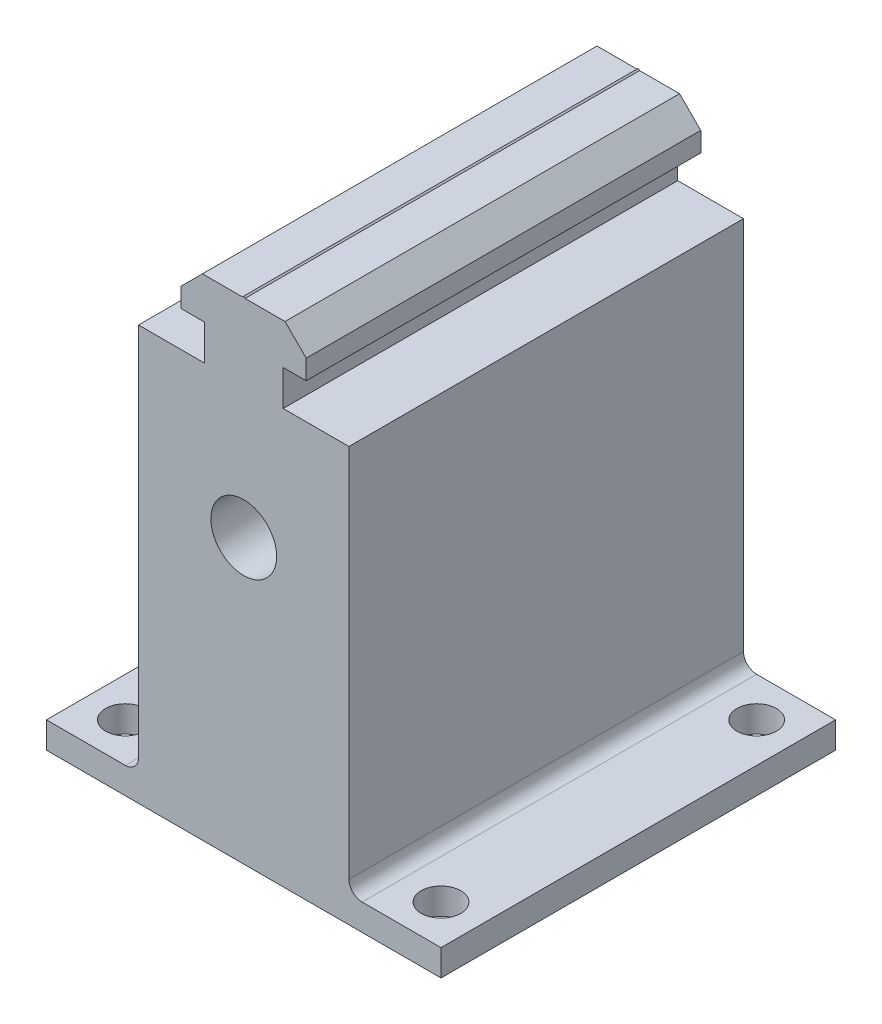
ISO-10303-21;
HEADER;
FILE_DESCRIPTION(('STEP AP214'),'2;1');
FILE_NAME('part.step','',(''),(''),'','','');
FILE_SCHEMA(('AUTOMOTIVE_DESIGN { 1 0 10303 214 1 1 1 1 }'));
ENDSEC;
DATA;
#1=APPLICATION_CONTEXT('core data for automotive mechanical design processes');
#2=APPLICATION_PROTOCOL_DEFINITION('international standard','automotive_design',2000,#1);
#3=PRODUCT_CONTEXT('',#1,'mechanical');
#4=PRODUCT('Part','Part','',(#3));
#5=PRODUCT_RELATED_PRODUCT_CATEGORY('part','',(#4));
#6=PRODUCT_DEFINITION_FORMATION('','',#4);
#7=PRODUCT_DEFINITION_CONTEXT('part definition',#1,'design');
#8=PRODUCT_DEFINITION('design','',#6,#7);
#9=PRODUCT_DEFINITION_SHAPE('','',#8);
#10=(LENGTH_UNIT() NAMED_UNIT(*) SI_UNIT(.MILLI.,.METRE.));
#11=(NAMED_UNIT(*) PLANE_ANGLE_UNIT() SI_UNIT($,.RADIAN.));
#12=(NAMED_UNIT(*) SI_UNIT($,.STERADIAN.) SOLID_ANGLE_UNIT());
#13=UNCERTAINTY_MEASURE_WITH_UNIT(LENGTH_MEASURE(1.E-05),#10,'distance_accuracy_value','');
#14=(GEOMETRIC_REPRESENTATION_CONTEXT(3) GLOBAL_UNCERTAINTY_ASSIGNED_CONTEXT((#13)) GLOBAL_UNIT_ASSIGNED_CONTEXT((#10,
#11,#12)) REPRESENTATION_CONTEXT('',''));
#15=CARTESIAN_POINT('',(0.,0.,0.));
#16=DIRECTION('',(0.,0.,1.));
#17=DIRECTION('',(1.,0.,0.));
#18=AXIS2_PLACEMENT_3D('',#15,#16,#17);
#19=CARTESIAN_POINT('',(0.,31.5,0.));
#20=DIRECTION('',(0.,1.,0.));
#21=DIRECTION('',(0.,0.,1.));
#22=AXIS2_PLACEMENT_3D('',#19,#20,#21);
#23=PLANE('',#22);
#24=DIRECTION('',(-1.,0.,0.));
#25=VECTOR('',#24,1.);
#26=CARTESIAN_POINT('',(-8.,31.5,-15.));
#27=LINE('',#26,#25);
#28=CARTESIAN_POINT('',(8.,31.5,-15.));
#29=VERTEX_POINT('',#28);
#30=CARTESIAN_POINT('',(2.99999999999999,31.5,-15.));
#31=VERTEX_POINT('',#30);
#32=EDGE_CURVE('E308',#29,#31,#27,.T.);
#33=ORIENTED_EDGE('',*,*,#32,.T.);
#34=DIRECTION('',(0.,0.,1.));
#35=VECTOR('',#34,1.);
#36=CARTESIAN_POINT('',(2.99999999999999,31.5,-15.));
#37=LINE('',#36,#35);
#38=CARTESIAN_POINT('',(2.99999999999999,31.5,15.));
#39=VERTEX_POINT('',#38);
#40=EDGE_CURVE('E283',#31,#39,#37,.T.);
#41=ORIENTED_EDGE('',*,*,#40,.T.);
#42=DIRECTION('',(1.,0.,0.));
#43=VECTOR('',#42,1.);
#44=CARTESIAN_POINT('',(-8.,31.5,15.));
#45=LINE('',#44,#43);
#46=CARTESIAN_POINT('',(8.,31.5,15.));
#47=VERTEX_POINT('',#46);
#48=EDGE_CURVE('E301',#39,#47,#45,.T.);
#49=ORIENTED_EDGE('',*,*,#48,.T.);
#50=DIRECTION('',(0.,0.,-1.));
#51=VECTOR('',#50,1.);
#52=CARTESIAN_POINT('',(8.,31.5,-15.));
#53=LINE('',#52,#51);
#54=EDGE_CURVE('E305',#47,#29,#53,.T.);
#55=ORIENTED_EDGE('',*,*,#54,.T.);
#56=EDGE_LOOP('',(#33,#41,#49,#55));
#57=FACE_BOUND('',#56,.T.);
#58=ADVANCED_FACE('F36',(#57),#23,.T.);
#59=CARTESIAN_POINT('',(0.,2.,0.));
#60=DIRECTION('',(0.,1.,0.));
#61=DIRECTION('',(0.,0.,1.));
#62=AXIS2_PLACEMENT_3D('',#59,#60,#61);
#63=PLANE('',#62);
#64=DIRECTION('',(1.,0.,0.));
#65=VECTOR('',#64,1.);
#66=CARTESIAN_POINT('',(0.,2.,15.));
#67=LINE('',#66,#65);
#68=CARTESIAN_POINT('',(-15.,2.,15.));
#69=VERTEX_POINT('',#68);
#70=CARTESIAN_POINT('',(-9.,2.,15.));
#71=VERTEX_POINT('',#70);
#72=EDGE_CURVE('E323',#69,#71,#67,.T.);
#73=ORIENTED_EDGE('',*,*,#72,.T.);
#74=DIRECTION('',(0.,0.,1.));
#75=VECTOR('',#74,1.);
#76=CARTESIAN_POINT('',(-9.,2.,0.));
#77=LINE('',#76,#75);
#78=CARTESIAN_POINT('',(-9.00000000000001,2.,-15.));
#79=VERTEX_POINT('',#78);
#80=EDGE_CURVE('E388',#71,#79,#77,.F.);
#81=ORIENTED_EDGE('',*,*,#80,.T.);
#82=DIRECTION('',(1.,0.,0.));
#83=VECTOR('',#82,1.);
#84=CARTESIAN_POINT('',(0.,2.,-15.));
#85=LINE('',#84,#83);
#86=CARTESIAN_POINT('',(-15.,2.,-15.));
#87=VERTEX_POINT('',#86);
#88=EDGE_CURVE('E330',#87,#79,#85,.T.);
#89=ORIENTED_EDGE('',*,*,#88,.F.);
#90=DIRECTION('',(0.,0.,-1.));
#91=VECTOR('',#90,1.);
#92=CARTESIAN_POINT('',(-15.,2.,0.));
#93=LINE('',#92,#91);
#94=EDGE_CURVE('E333',#69,#87,#93,.T.);
#95=ORIENTED_EDGE('',*,*,#94,.F.);
#96=EDGE_LOOP('',(#73,#81,#89,#95));
#97=FACE_BOUND('',#96,.T.);
#98=CARTESIAN_POINT('',(-12.,2.,-12.));
#99=DIRECTION('',(0.,1.,0.));
#100=DIRECTION('',(0.,0.,1.));
#101=AXIS2_PLACEMENT_3D('',#98,#99,#100);
#102=CIRCLE('',#101,1.5);
#103=CARTESIAN_POINT('',(-12.,2.,-10.5));
#104=VERTEX_POINT('',#103);
#105=EDGE_CURVE('E339',#104,#104,#102,.T.);
#106=ORIENTED_EDGE('',*,*,#105,.F.);
#107=EDGE_LOOP('',(#106));
#108=FACE_BOUND('',#107,.T.);
#109=CARTESIAN_POINT('',(-12.,2.,12.));
#110=DIRECTION('',(0.,1.,0.));
#111=DIRECTION('',(0.,0.,1.));
#112=AXIS2_PLACEMENT_3D('',#109,#110,#111);
#113=CIRCLE('',#112,1.5);
#114=CARTESIAN_POINT('',(-12.,2.,13.5));
#115=VERTEX_POINT('',#114);
#116=EDGE_CURVE('E336',#115,#115,#113,.F.);
#117=ORIENTED_EDGE('',*,*,#116,.T.);
#118=EDGE_LOOP('',(#117));
#119=FACE_BOUND('',#118,.T.);
#120=ADVANCED_FACE('F427',(#97,#108,#119),#63,.T.);
#121=CARTESIAN_POINT('',(0.,2.,15.));
#122=DIRECTION('',(0.,0.,-1.));
#123=DIRECTION('',(-1.,0.,0.));
#124=AXIS2_PLACEMENT_3D('',#121,#122,#123);
#125=PLANE('',#124);
#126=CARTESIAN_POINT('',(0.,21.5,15.));
#127=DIRECTION('',(0.,0.,1.));
#128=DIRECTION('',(1.,0.,0.));
#129=AXIS2_PLACEMENT_3D('',#126,#127,#128);
#130=CIRCLE('',#129,2.5);
#131=CARTESIAN_POINT('',(2.5,21.5,15.));
#132=VERTEX_POINT('',#131);
#133=EDGE_CURVE('E272',#132,#132,#130,.T.);
#134=ORIENTED_EDGE('',*,*,#133,.F.);
#135=EDGE_LOOP('',(#134));
#136=FACE_BOUND('',#135,.T.);
#137=DIRECTION('',(1.,0.,0.));
#138=VECTOR('',#137,1.);
#139=CARTESIAN_POINT('',(0.,0.,15.));
#140=LINE('',#139,#138);
#141=CARTESIAN_POINT('',(-15.,0.,15.));
#142=VERTEX_POINT('',#141);
#143=CARTESIAN_POINT('',(15.,0.,15.));
#144=VERTEX_POINT('',#143);
#145=EDGE_CURVE('E322',#142,#144,#140,.T.);
#146=ORIENTED_EDGE('',*,*,#145,.T.);
#147=DIRECTION('',(0.,-1.,0.));
#148=VECTOR('',#147,1.);
#149=CARTESIAN_POINT('',(15.,2.,15.));
#150=LINE('',#149,#148);
#151=CARTESIAN_POINT('',(15.,2.,15.));
#152=VERTEX_POINT('',#151);
#153=EDGE_CURVE('E377',#152,#144,#150,.T.);
#154=ORIENTED_EDGE('',*,*,#153,.F.);
#155=CARTESIAN_POINT('',(9.,2.,15.));
#156=VERTEX_POINT('',#155);
#157=EDGE_CURVE('E326',#156,#152,#67,.T.);
#158=ORIENTED_EDGE('',*,*,#157,.F.);
#159=CARTESIAN_POINT('',(9.,3.,15.));
#160=DIRECTION('',(0.,0.,-1.));
#161=DIRECTION('',(-1.,0.,0.));
#162=AXIS2_PLACEMENT_3D('',#159,#160,#161);
#163=CIRCLE('',#162,1.);
#164=CARTESIAN_POINT('',(8.,3.,15.));
#165=VERTEX_POINT('',#164);
#166=EDGE_CURVE('E392',#156,#165,#163,.T.);
#167=ORIENTED_EDGE('',*,*,#166,.T.);
#168=DIRECTION('',(0.,-1.,0.));
#169=VECTOR('',#168,1.);
#170=CARTESIAN_POINT('',(8.,31.5,15.));
#171=LINE('',#170,#169);
#172=EDGE_CURVE('E317',#47,#165,#171,.T.);
#173=ORIENTED_EDGE('',*,*,#172,.F.);
#174=ORIENTED_EDGE('',*,*,#48,.F.);
#175=DIRECTION('',(0.,-1.,0.));
#176=VECTOR('',#175,1.);
#177=CARTESIAN_POINT('',(2.99999999999999,0.,15.));
#178=LINE('',#177,#176);
#179=CARTESIAN_POINT('',(2.99999999999999,34.2,15.));
#180=VERTEX_POINT('',#179);
#181=EDGE_CURVE('E52',#180,#39,#178,.T.);
#182=ORIENTED_EDGE('',*,*,#181,.F.);
#183=DIRECTION('',(1.,0.,0.));
#184=VECTOR('',#183,1.);
#185=CARTESIAN_POINT('',(-8.13634873761013E-13,34.1999999999999,15.));
#186=LINE('',#185,#184);
#187=CARTESIAN_POINT('',(4.74999999999997,34.2,15.));
#188=VERTEX_POINT('',#187);
#189=EDGE_CURVE('E262',#180,#188,#186,.T.);
#190=ORIENTED_EDGE('',*,*,#189,.T.);
#191=DIRECTION('',(0.,-1.,0.));
#192=VECTOR('',#191,1.);
#193=CARTESIAN_POINT('',(4.75000000000023,0.,15.));
#194=LINE('',#193,#192);
#195=CARTESIAN_POINT('',(4.74999999999997,35.6893398282203,15.));
#196=VERTEX_POINT('',#195);
#197=EDGE_CURVE('E265',#196,#188,#194,.T.);
#198=ORIENTED_EDGE('',*,*,#197,.F.);
#199=DIRECTION('',(0.707106781186555,-0.70710678118654,0.));
#200=VECTOR('',#199,1.);
#201=CARTESIAN_POINT('',(20.2196699141101,20.2196699141105,15.));
#202=LINE('',#201,#200);
#203=CARTESIAN_POINT('',(3.13933982822018,37.3,15.));
#204=VERTEX_POINT('',#203);
#205=EDGE_CURVE('E268',#204,#196,#202,.T.);
#206=ORIENTED_EDGE('',*,*,#205,.F.);
#207=DIRECTION('',(1.,0.,0.));
#208=VECTOR('',#207,1.);
#209=CARTESIAN_POINT('',(-3.40627579992989E-13,37.3,15.));
#210=LINE('',#209,#208);
#211=CARTESIAN_POINT('',(0.0999999999999543,37.3,15.));
#212=VERTEX_POINT('',#211);
#213=EDGE_CURVE('E212',#212,#204,#210,.T.);
#214=ORIENTED_EDGE('',*,*,#213,.F.);
#215=DIRECTION('',(0.707106781186548,-0.707106781186547,0.));
#216=VECTOR('',#215,1.);
#217=CARTESIAN_POINT('',(18.7,18.7,15.));
#218=LINE('',#217,#216);
#219=CARTESIAN_POINT('',(0.,37.4,15.));
#220=VERTEX_POINT('',#219);
#221=EDGE_CURVE('E243',#220,#212,#218,.T.);
#222=ORIENTED_EDGE('',*,*,#221,.F.);
#223=DIRECTION('',(-0.707106781186543,-0.707106781186552,0.));
#224=VECTOR('',#223,1.);
#225=CARTESIAN_POINT('',(-18.7,18.6999999999998,15.));
#226=LINE('',#225,#224);
#227=CARTESIAN_POINT('',(-0.100000000000044,37.3,15.));
#228=VERTEX_POINT('',#227);
#229=EDGE_CURVE('E198',#220,#228,#226,.T.);
#230=ORIENTED_EDGE('',*,*,#229,.T.);
#231=DIRECTION('',(-1.,0.,0.));
#232=VECTOR('',#231,1.);
#233=CARTESIAN_POINT('',(-2.55470684994742E-13,37.3,15.));
#234=LINE('',#233,#232);
#235=CARTESIAN_POINT('',(-3.13933982822026,37.3,15.));
#236=VERTEX_POINT('',#235);
#237=EDGE_CURVE('E246',#228,#236,#234,.T.);
#238=ORIENTED_EDGE('',*,*,#237,.T.);
#239=DIRECTION('',(-0.707106781186546,-0.707106781186549,0.));
#240=VECTOR('',#239,1.);
#241=CARTESIAN_POINT('',(-20.2196699141101,20.21966991411,15.));
#242=LINE('',#241,#240);
#243=CARTESIAN_POINT('',(-4.75000000000003,35.6893398282202,15.));
#244=VERTEX_POINT('',#243);
#245=EDGE_CURVE('E249',#236,#244,#242,.T.);
#246=ORIENTED_EDGE('',*,*,#245,.T.);
#247=DIRECTION('',(0.,-1.,0.));
#248=VECTOR('',#247,1.);
#249=CARTESIAN_POINT('',(-4.74999999999977,0.,15.));
#250=LINE('',#249,#248);
#251=CARTESIAN_POINT('',(-4.75000000000011,34.2,15.));
#252=VERTEX_POINT('',#251);
#253=EDGE_CURVE('E252',#244,#252,#250,.T.);
#254=ORIENTED_EDGE('',*,*,#253,.T.);
#255=DIRECTION('',(-1.,0.,0.));
#256=VECTOR('',#255,1.);
#257=CARTESIAN_POINT('',(0.,34.2,15.));
#258=LINE('',#257,#256);
#259=CARTESIAN_POINT('',(-3.00000000000002,34.2,15.));
#260=VERTEX_POINT('',#259);
#261=EDGE_CURVE('E255',#260,#252,#258,.T.);
#262=ORIENTED_EDGE('',*,*,#261,.F.);
#263=DIRECTION('',(0.,-1.,0.));
#264=VECTOR('',#263,1.);
#265=CARTESIAN_POINT('',(-3.00000000000002,0.,15.));
#266=LINE('',#265,#264);
#267=CARTESIAN_POINT('',(-3.00000000000002,31.5,15.));
#268=VERTEX_POINT('',#267);
#269=EDGE_CURVE('E258',#260,#268,#266,.T.);
#270=ORIENTED_EDGE('',*,*,#269,.T.);
#271=CARTESIAN_POINT('',(-8.,31.5,15.));
#272=VERTEX_POINT('',#271);
#273=EDGE_CURVE('E302',#272,#268,#45,.T.);
#274=ORIENTED_EDGE('',*,*,#273,.F.);
#275=DIRECTION('',(0.,-1.,0.));
#276=VECTOR('',#275,1.);
#277=CARTESIAN_POINT('',(-8.,31.5,15.));
#278=LINE('',#277,#276);
#279=CARTESIAN_POINT('',(-8.,3.,15.));
#280=VERTEX_POINT('',#279);
#281=EDGE_CURVE('E320',#272,#280,#278,.T.);
#282=ORIENTED_EDGE('',*,*,#281,.T.);
#283=CARTESIAN_POINT('',(-9.,3.,15.));
#284=DIRECTION('',(0.,0.,-1.));
#285=DIRECTION('',(-1.,0.,0.));
#286=AXIS2_PLACEMENT_3D('',#283,#284,#285);
#287=CIRCLE('',#286,1.);
#288=EDGE_CURVE('E45',#280,#71,#287,.T.);
#289=ORIENTED_EDGE('',*,*,#288,.T.);
#290=ORIENTED_EDGE('',*,*,#72,.F.);
#291=DIRECTION('',(0.,-1.,0.));
#292=VECTOR('',#291,1.);
#293=CARTESIAN_POINT('',(-15.,2.,15.));
#294=LINE('',#293,#292);
#295=EDGE_CURVE('E348',#69,#142,#294,.T.);
#296=ORIENTED_EDGE('',*,*,#295,.T.);
#297=EDGE_LOOP('',(#146,#154,#158,#167,#173,#174,#182,#190,#198,#206,#214,#222,#230,#238,#246,
#254,#262,#270,#274,#282,#289,#290,#296));
#298=FACE_BOUND('',#297,.T.);
#299=ADVANCED_FACE('F397',(#136,#298),#125,.F.);
#300=CARTESIAN_POINT('',(15.,2.,0.));
#301=DIRECTION('',(-1.,0.,0.));
#302=DIRECTION('',(0.,0.,1.));
#303=AXIS2_PLACEMENT_3D('',#300,#301,#302);
#304=PLANE('',#303);
#305=DIRECTION('',(0.,0.,-1.));
#306=VECTOR('',#305,1.);
#307=CARTESIAN_POINT('',(15.,0.,0.));
#308=LINE('',#307,#306);
#309=CARTESIAN_POINT('',(15.,0.,-15.));
#310=VERTEX_POINT('',#309);
#311=EDGE_CURVE('E351',#144,#310,#308,.T.);
#312=ORIENTED_EDGE('',*,*,#311,.T.);
#313=DIRECTION('',(0.,-1.,0.));
#314=VECTOR('',#313,1.);
#315=CARTESIAN_POINT('',(15.,2.,-15.));
#316=LINE('',#315,#314);
#317=CARTESIAN_POINT('',(15.,2.,-15.));
#318=VERTEX_POINT('',#317);
#319=EDGE_CURVE('E375',#318,#310,#316,.T.);
#320=ORIENTED_EDGE('',*,*,#319,.F.);
#321=DIRECTION('',(0.,0.,-1.));
#322=VECTOR('',#321,1.);
#323=CARTESIAN_POINT('',(15.,2.,0.));
#324=LINE('',#323,#322);
#325=EDGE_CURVE('E325',#152,#318,#324,.T.);
#326=ORIENTED_EDGE('',*,*,#325,.F.);
#327=ORIENTED_EDGE('',*,*,#153,.T.);
#328=EDGE_LOOP('',(#312,#320,#326,#327));
#329=FACE_BOUND('',#328,.T.);
#330=ADVANCED_FACE('F416',(#329),#304,.F.);
#331=CARTESIAN_POINT('',(0.,2.,-15.));
#332=DIRECTION('',(0.,0.,-1.));
#333=DIRECTION('',(-1.,0.,0.));
#334=AXIS2_PLACEMENT_3D('',#331,#332,#333);
#335=PLANE('',#334);
#336=CARTESIAN_POINT('',(0.,21.5,-15.));
#337=DIRECTION('',(0.,0.,-1.));
#338=DIRECTION('',(-1.,0.,0.));
#339=AXIS2_PLACEMENT_3D('',#336,#337,#338);
#340=CIRCLE('',#339,2.5);
#341=CARTESIAN_POINT('',(-2.5,21.5,-15.));
#342=VERTEX_POINT('',#341);
#343=EDGE_CURVE('E40',#342,#342,#340,.T.);
#344=ORIENTED_EDGE('',*,*,#343,.F.);
#345=EDGE_LOOP('',(#344));
#346=FACE_BOUND('',#345,.T.);
#347=DIRECTION('',(1.,0.,0.));
#348=VECTOR('',#347,1.);
#349=CARTESIAN_POINT('',(0.,0.,-15.));
#350=LINE('',#349,#348);
#351=CARTESIAN_POINT('',(-15.,0.,-15.));
#352=VERTEX_POINT('',#351);
#353=EDGE_CURVE('E354',#352,#310,#350,.T.);
#354=ORIENTED_EDGE('',*,*,#353,.F.);
#355=DIRECTION('',(0.,-1.,0.));
#356=VECTOR('',#355,1.);
#357=CARTESIAN_POINT('',(-15.,2.,-15.));
#358=LINE('',#357,#356);
#359=EDGE_CURVE('E373',#87,#352,#358,.T.);
#360=ORIENTED_EDGE('',*,*,#359,.F.);
#361=ORIENTED_EDGE('',*,*,#88,.T.);
#362=CARTESIAN_POINT('',(-9.00000000000001,3.,-15.));
#363=DIRECTION('',(0.,0.,-1.));
#364=DIRECTION('',(-1.,0.,0.));
#365=AXIS2_PLACEMENT_3D('',#362,#363,#364);
#366=CIRCLE('',#365,1.);
#367=CARTESIAN_POINT('',(-8.,3.,-15.));
#368=VERTEX_POINT('',#367);
#369=EDGE_CURVE('E11',#79,#368,#366,.F.);
#370=ORIENTED_EDGE('',*,*,#369,.T.);
#371=DIRECTION('',(0.,-1.,0.));
#372=VECTOR('',#371,1.);
#373=CARTESIAN_POINT('',(-8.,31.5,-15.));
#374=LINE('',#373,#372);
#375=CARTESIAN_POINT('',(-8.,31.5,-15.));
#376=VERTEX_POINT('',#375);
#377=EDGE_CURVE('E311',#376,#368,#374,.T.);
#378=ORIENTED_EDGE('',*,*,#377,.F.);
#379=CARTESIAN_POINT('',(-3.00000000000002,31.5,-15.));
#380=VERTEX_POINT('',#379);
#381=EDGE_CURVE('E307',#380,#376,#27,.T.);
#382=ORIENTED_EDGE('',*,*,#381,.F.);
#383=DIRECTION('',(0.,-1.,0.));
#384=VECTOR('',#383,1.);
#385=CARTESIAN_POINT('',(-3.00000000000002,0.,-15.));
#386=LINE('',#385,#384);
#387=CARTESIAN_POINT('',(-3.00000000000002,34.2,-15.));
#388=VERTEX_POINT('',#387);
#389=EDGE_CURVE('E231',#388,#380,#386,.T.);
#390=ORIENTED_EDGE('',*,*,#389,.F.);
#391=DIRECTION('',(-1.,0.,0.));
#392=VECTOR('',#391,1.);
#393=CARTESIAN_POINT('',(0.,34.2,-15.));
#394=LINE('',#393,#392);
#395=CARTESIAN_POINT('',(-4.75000000000011,34.2,-15.));
#396=VERTEX_POINT('',#395);
#397=EDGE_CURVE('E229',#388,#396,#394,.T.);
#398=ORIENTED_EDGE('',*,*,#397,.T.);
#399=DIRECTION('',(0.,-1.,0.));
#400=VECTOR('',#399,1.);
#401=CARTESIAN_POINT('',(-4.74999999999977,0.,-15.));
#402=LINE('',#401,#400);
#403=CARTESIAN_POINT('',(-4.75000000000003,35.6893398282202,-15.));
#404=VERTEX_POINT('',#403);
#405=EDGE_CURVE('E226',#404,#396,#402,.T.);
#406=ORIENTED_EDGE('',*,*,#405,.F.);
#407=DIRECTION('',(-0.707106781186546,-0.707106781186549,0.));
#408=VECTOR('',#407,1.);
#409=CARTESIAN_POINT('',(-20.2196699141101,20.21966991411,-15.));
#410=LINE('',#409,#408);
#411=CARTESIAN_POINT('',(-3.13933982822026,37.3,-15.));
#412=VERTEX_POINT('',#411);
#413=EDGE_CURVE('E221',#412,#404,#410,.T.);
#414=ORIENTED_EDGE('',*,*,#413,.F.);
#415=DIRECTION('',(-1.,0.,0.));
#416=VECTOR('',#415,1.);
#417=CARTESIAN_POINT('',(-2.55470684994742E-13,37.3,-15.));
#418=LINE('',#417,#416);
#419=CARTESIAN_POINT('',(-0.100000000000044,37.3,-15.));
#420=VERTEX_POINT('',#419);
#421=EDGE_CURVE('E219',#420,#412,#418,.T.);
#422=ORIENTED_EDGE('',*,*,#421,.F.);
#423=DIRECTION('',(-0.707106781186543,-0.707106781186552,0.));
#424=VECTOR('',#423,1.);
#425=CARTESIAN_POINT('',(-18.7,18.6999999999998,-15.));
#426=LINE('',#425,#424);
#427=CARTESIAN_POINT('',(0.,37.4,-15.));
#428=VERTEX_POINT('',#427);
#429=EDGE_CURVE('E196',#428,#420,#426,.T.);
#430=ORIENTED_EDGE('',*,*,#429,.F.);
#431=DIRECTION('',(0.707106781186548,-0.707106781186547,0.));
#432=VECTOR('',#431,1.);
#433=CARTESIAN_POINT('',(18.7,18.7,-15.));
#434=LINE('',#433,#432);
#435=CARTESIAN_POINT('',(0.0999999999999543,37.3,-15.));
#436=VERTEX_POINT('',#435);
#437=EDGE_CURVE('E207',#428,#436,#434,.T.);
#438=ORIENTED_EDGE('',*,*,#437,.T.);
#439=DIRECTION('',(1.,0.,0.));
#440=VECTOR('',#439,1.);
#441=CARTESIAN_POINT('',(-3.40627579992989E-13,37.3,-15.));
#442=LINE('',#441,#440);
#443=CARTESIAN_POINT('',(3.13933982822018,37.3,-15.));
#444=VERTEX_POINT('',#443);
#445=EDGE_CURVE('E203',#436,#444,#442,.T.);
#446=ORIENTED_EDGE('',*,*,#445,.T.);
#447=DIRECTION('',(0.707106781186555,-0.70710678118654,0.));
#448=VECTOR('',#447,1.);
#449=CARTESIAN_POINT('',(20.2196699141101,20.2196699141105,-15.));
#450=LINE('',#449,#448);
#451=CARTESIAN_POINT('',(4.74999999999997,35.6893398282203,-15.));
#452=VERTEX_POINT('',#451);
#453=EDGE_CURVE('E240',#444,#452,#450,.T.);
#454=ORIENTED_EDGE('',*,*,#453,.T.);
#455=DIRECTION('',(0.,-1.,0.));
#456=VECTOR('',#455,1.);
#457=CARTESIAN_POINT('',(4.75000000000023,0.,-15.));
#458=LINE('',#457,#456);
#459=CARTESIAN_POINT('',(4.74999999999997,34.2,-15.));
#460=VERTEX_POINT('',#459);
#461=EDGE_CURVE('E238',#452,#460,#458,.T.);
#462=ORIENTED_EDGE('',*,*,#461,.T.);
#463=DIRECTION('',(1.,0.,0.));
#464=VECTOR('',#463,1.);
#465=CARTESIAN_POINT('',(-8.13634873761013E-13,34.1999999999999,-15.));
#466=LINE('',#465,#464);
#467=CARTESIAN_POINT('',(2.99999999999999,34.2,-15.));
#468=VERTEX_POINT('',#467);
#469=EDGE_CURVE('E235',#468,#460,#466,.T.);
#470=ORIENTED_EDGE('',*,*,#469,.F.);
#471=DIRECTION('',(0.,-1.,0.));
#472=VECTOR('',#471,1.);
#473=CARTESIAN_POINT('',(2.99999999999999,0.,-15.));
#474=LINE('',#473,#472);
#475=EDGE_CURVE('E233',#468,#31,#474,.T.);
#476=ORIENTED_EDGE('',*,*,#475,.T.);
#477=ORIENTED_EDGE('',*,*,#32,.F.);
#478=DIRECTION('',(0.,-1.,0.));
#479=VECTOR('',#478,1.);
#480=CARTESIAN_POINT('',(8.,31.5,-15.));
#481=LINE('',#480,#479);
#482=CARTESIAN_POINT('',(8.,3.,-15.));
#483=VERTEX_POINT('',#482);
#484=EDGE_CURVE('E314',#29,#483,#481,.T.);
#485=ORIENTED_EDGE('',*,*,#484,.T.);
#486=CARTESIAN_POINT('',(9.00000000000001,3.,-15.));
#487=DIRECTION('',(0.,0.,-1.));
#488=DIRECTION('',(-1.,0.,0.));
#489=AXIS2_PLACEMENT_3D('',#486,#487,#488);
#490=CIRCLE('',#489,1.);
#491=CARTESIAN_POINT('',(9.00000000000001,2.,-15.));
#492=VERTEX_POINT('',#491);
#493=EDGE_CURVE('E390',#483,#492,#490,.F.);
#494=ORIENTED_EDGE('',*,*,#493,.T.);
#495=EDGE_CURVE('E329',#492,#318,#85,.T.);
#496=ORIENTED_EDGE('',*,*,#495,.T.);
#497=ORIENTED_EDGE('',*,*,#319,.T.);
#498=EDGE_LOOP('',(#354,#360,#361,#370,#378,#382,#390,#398,#406,#414,#422,#430,#438,#446,#454,
#462,#470,#476,#477,#485,#494,#496,#497));
#499=FACE_BOUND('',#498,.T.);
#500=ADVANCED_FACE('F216',(#346,#499),#335,.T.);
#501=CARTESIAN_POINT('',(12.,2.,-12.));
#502=DIRECTION('',(0.,-1.,0.));
#503=DIRECTION('',(0.,0.,-1.));
#504=AXIS2_PLACEMENT_3D('',#501,#502,#503);
#505=CYLINDRICAL_SURFACE('',#504,1.5);
#506=CARTESIAN_POINT('',(12.,2.,-12.));
#507=DIRECTION('',(0.,1.,0.));
#508=DIRECTION('',(0.,0.,1.));
#509=AXIS2_PLACEMENT_3D('',#506,#507,#508);
#510=CIRCLE('',#509,1.5);
#511=CARTESIAN_POINT('',(12.,2.,-10.5));
#512=VERTEX_POINT('',#511);
#513=EDGE_CURVE('E342',#512,#512,#510,.F.);
#514=ORIENTED_EDGE('',*,*,#513,.F.);
#515=EDGE_LOOP('',(#514));
#516=FACE_BOUND('',#515,.T.);
#517=CARTESIAN_POINT('',(12.,0.,-12.));
#518=DIRECTION('',(0.,1.,0.));
#519=DIRECTION('',(0.,0.,1.));
#520=AXIS2_PLACEMENT_3D('',#517,#518,#519);
#521=CIRCLE('',#520,1.5);
#522=CARTESIAN_POINT('',(12.,0.,-10.5));
#523=VERTEX_POINT('',#522);
#524=EDGE_CURVE('E366',#523,#523,#521,.F.);
#525=ORIENTED_EDGE('',*,*,#524,.T.);
#526=EDGE_LOOP('',(#525));
#527=FACE_BOUND('',#526,.T.);
#528=ADVANCED_FACE('F506',(#516,#527),#505,.F.);
#529=CARTESIAN_POINT('',(-12.,2.,-12.));
#530=DIRECTION('',(0.,-1.,0.));
#531=DIRECTION('',(0.,0.,-1.));
#532=AXIS2_PLACEMENT_3D('',#529,#530,#531);
#533=CYLINDRICAL_SURFACE('',#532,1.5);
#534=ORIENTED_EDGE('',*,*,#105,.T.);
#535=EDGE_LOOP('',(#534));
#536=FACE_BOUND('',#535,.T.);
#537=CARTESIAN_POINT('',(-12.,0.,-12.));
#538=DIRECTION('',(0.,1.,0.));
#539=DIRECTION('',(0.,0.,1.));
#540=AXIS2_PLACEMENT_3D('',#537,#538,#539);
#541=CIRCLE('',#540,1.5);
#542=CARTESIAN_POINT('',(-12.,0.,-10.5));
#543=VERTEX_POINT('',#542);
#544=EDGE_CURVE('E363',#543,#543,#541,.T.);
#545=ORIENTED_EDGE('',*,*,#544,.F.);
#546=EDGE_LOOP('',(#545));
#547=FACE_BOUND('',#546,.T.);
#548=ADVANCED_FACE('F509',(#536,#547),#533,.F.);
#549=CARTESIAN_POINT('',(-12.,2.,12.));
#550=DIRECTION('',(0.,-1.,0.));
#551=DIRECTION('',(0.,0.,-1.));
#552=AXIS2_PLACEMENT_3D('',#549,#550,#551);
#553=CYLINDRICAL_SURFACE('',#552,1.5);
#554=ORIENTED_EDGE('',*,*,#116,.F.);
#555=EDGE_LOOP('',(#554));
#556=FACE_BOUND('',#555,.T.);
#557=CARTESIAN_POINT('',(-12.,0.,12.));
#558=DIRECTION('',(0.,1.,0.));
#559=DIRECTION('',(0.,0.,1.));
#560=AXIS2_PLACEMENT_3D('',#557,#558,#559);
#561=CIRCLE('',#560,1.5);
#562=CARTESIAN_POINT('',(-12.,0.,13.5));
#563=VERTEX_POINT('',#562);
#564=EDGE_CURVE('E360',#563,#563,#561,.F.);
#565=ORIENTED_EDGE('',*,*,#564,.T.);
#566=EDGE_LOOP('',(#565));
#567=FACE_BOUND('',#566,.T.);
#568=ADVANCED_FACE('F513',(#556,#567),#553,.F.);
#569=CARTESIAN_POINT('',(-15.,2.,0.));
#570=DIRECTION('',(-1.,0.,0.));
#571=DIRECTION('',(0.,0.,1.));
#572=AXIS2_PLACEMENT_3D('',#569,#570,#571);
#573=PLANE('',#572);
#574=DIRECTION('',(0.,0.,-1.));
#575=VECTOR('',#574,1.);
#576=CARTESIAN_POINT('',(-15.,0.,0.));
#577=LINE('',#576,#575);
#578=EDGE_CURVE('E357',#142,#352,#577,.T.);
#579=ORIENTED_EDGE('',*,*,#578,.F.);
#580=ORIENTED_EDGE('',*,*,#295,.F.);
#581=ORIENTED_EDGE('',*,*,#94,.T.);
#582=ORIENTED_EDGE('',*,*,#359,.T.);
#583=EDGE_LOOP('',(#579,#580,#581,#582));
#584=FACE_BOUND('',#583,.T.);
#585=ADVANCED_FACE('F424',(#584),#573,.T.);
#586=CARTESIAN_POINT('',(12.,2.,12.));
#587=DIRECTION('',(0.,-1.,0.));
#588=DIRECTION('',(0.,0.,-1.));
#589=AXIS2_PLACEMENT_3D('',#586,#587,#588);
#590=CYLINDRICAL_SURFACE('',#589,1.5);
#591=CARTESIAN_POINT('',(12.,2.,12.));
#592=DIRECTION('',(0.,1.,0.));
#593=DIRECTION('',(0.,0.,1.));
#594=AXIS2_PLACEMENT_3D('',#591,#592,#593);
#595=CIRCLE('',#594,1.5);
#596=CARTESIAN_POINT('',(12.,2.,13.5));
#597=VERTEX_POINT('',#596);
#598=EDGE_CURVE('E345',#597,#597,#595,.T.);
#599=ORIENTED_EDGE('',*,*,#598,.T.);
#600=EDGE_LOOP('',(#599));
#601=FACE_BOUND('',#600,.T.);
#602=CARTESIAN_POINT('',(12.,0.,12.));
#603=DIRECTION('',(0.,1.,0.));
#604=DIRECTION('',(0.,0.,1.));
#605=AXIS2_PLACEMENT_3D('',#602,#603,#604);
#606=CIRCLE('',#605,1.5);
#607=CARTESIAN_POINT('',(12.,0.,13.5));
#608=VERTEX_POINT('',#607);
#609=EDGE_CURVE('E369',#608,#608,#606,.T.);
#610=ORIENTED_EDGE('',*,*,#609,.F.);
#611=EDGE_LOOP('',(#610));
#612=FACE_BOUND('',#611,.T.);
#613=ADVANCED_FACE('F500',(#601,#612),#590,.F.);
#614=ORIENTED_EDGE('',*,*,#495,.F.);
#615=DIRECTION('',(0.,0.,-1.));
#616=VECTOR('',#615,1.);
#617=CARTESIAN_POINT('',(9.,2.,0.));
#618=LINE('',#617,#616);
#619=EDGE_CURVE('E383',#492,#156,#618,.F.);
#620=ORIENTED_EDGE('',*,*,#619,.T.);
#621=ORIENTED_EDGE('',*,*,#157,.T.);
#622=ORIENTED_EDGE('',*,*,#325,.T.);
#623=EDGE_LOOP('',(#614,#620,#621,#622));
#624=FACE_BOUND('',#623,.T.);
#625=ORIENTED_EDGE('',*,*,#513,.T.);
#626=EDGE_LOOP('',(#625));
#627=FACE_BOUND('',#626,.T.);
#628=ORIENTED_EDGE('',*,*,#598,.F.);
#629=EDGE_LOOP('',(#628));
#630=FACE_BOUND('',#629,.T.);
#631=ADVANCED_FACE('F411',(#624,#627,#630),#63,.T.);
#632=CARTESIAN_POINT('',(0.,0.,0.));
#633=DIRECTION('',(0.,1.,0.));
#634=DIRECTION('',(0.,0.,1.));
#635=AXIS2_PLACEMENT_3D('',#632,#633,#634);
#636=PLANE('',#635);
#637=ORIENTED_EDGE('',*,*,#145,.F.);
#638=ORIENTED_EDGE('',*,*,#578,.T.);
#639=ORIENTED_EDGE('',*,*,#353,.T.);
#640=ORIENTED_EDGE('',*,*,#311,.F.);
#641=EDGE_LOOP('',(#637,#638,#639,#640));
#642=FACE_BOUND('',#641,.T.);
#643=ORIENTED_EDGE('',*,*,#564,.F.);
#644=EDGE_LOOP('',(#643));
#645=FACE_BOUND('',#644,.T.);
#646=ORIENTED_EDGE('',*,*,#544,.T.);
#647=EDGE_LOOP('',(#646));
#648=FACE_BOUND('',#647,.T.);
#649=ORIENTED_EDGE('',*,*,#524,.F.);
#650=EDGE_LOOP('',(#649));
#651=FACE_BOUND('',#650,.T.);
#652=ORIENTED_EDGE('',*,*,#609,.T.);
#653=EDGE_LOOP('',(#652));
#654=FACE_BOUND('',#653,.T.);
#655=ADVANCED_FACE('F421',(#642,#645,#648,#651,#654),#636,.F.);
#656=CARTESIAN_POINT('',(-8.,31.5,-15.));
#657=DIRECTION('',(1.,0.,0.));
#658=DIRECTION('',(0.,0.,-1.));
#659=AXIS2_PLACEMENT_3D('',#656,#657,#658);
#660=PLANE('',#659);
#661=ORIENTED_EDGE('',*,*,#377,.T.);
#662=DIRECTION('',(0.,0.,1.));
#663=VECTOR('',#662,1.);
#664=CARTESIAN_POINT('',(-8.,3.,-15.));
#665=LINE('',#664,#663);
#666=EDGE_CURVE('E385',#368,#280,#665,.T.);
#667=ORIENTED_EDGE('',*,*,#666,.T.);
#668=ORIENTED_EDGE('',*,*,#281,.F.);
#669=DIRECTION('',(0.,0.,1.));
#670=VECTOR('',#669,1.);
#671=CARTESIAN_POINT('',(-8.,31.5,-15.));
#672=LINE('',#671,#670);
#673=EDGE_CURVE('E298',#376,#272,#672,.T.);
#674=ORIENTED_EDGE('',*,*,#673,.F.);
#675=EDGE_LOOP('',(#661,#667,#668,#674));
#676=FACE_BOUND('',#675,.T.);
#677=ADVANCED_FACE('F436',(#676),#660,.F.);
#678=CARTESIAN_POINT('',(8.,31.5,-15.));
#679=DIRECTION('',(-1.,0.,0.));
#680=DIRECTION('',(0.,0.,1.));
#681=AXIS2_PLACEMENT_3D('',#678,#679,#680);
#682=PLANE('',#681);
#683=ORIENTED_EDGE('',*,*,#172,.T.);
#684=DIRECTION('',(0.,0.,-1.));
#685=VECTOR('',#684,1.);
#686=CARTESIAN_POINT('',(8.,3.,-15.));
#687=LINE('',#686,#685);
#688=EDGE_CURVE('E380',#165,#483,#687,.T.);
#689=ORIENTED_EDGE('',*,*,#688,.T.);
#690=ORIENTED_EDGE('',*,*,#484,.F.);
#691=ORIENTED_EDGE('',*,*,#54,.F.);
#692=EDGE_LOOP('',(#683,#689,#690,#691));
#693=FACE_BOUND('',#692,.T.);
#694=ADVANCED_FACE('F405',(#693),#682,.F.);
#695=DIRECTION('',(0.,0.,1.));
#696=VECTOR('',#695,1.);
#697=CARTESIAN_POINT('',(-3.00000000000002,31.5,-15.));
#698=LINE('',#697,#696);
#699=EDGE_CURVE('E285',#380,#268,#698,.T.);
#700=ORIENTED_EDGE('',*,*,#699,.F.);
#701=ORIENTED_EDGE('',*,*,#381,.T.);
#702=ORIENTED_EDGE('',*,*,#673,.T.);
#703=ORIENTED_EDGE('',*,*,#273,.T.);
#704=EDGE_LOOP('',(#700,#701,#702,#703));
#705=FACE_BOUND('',#704,.T.);
#706=ADVANCED_FACE('F442',(#705),#23,.T.);
#707=CARTESIAN_POINT('',(9.00000000000001,3.,-15.));
#708=DIRECTION('',(0.,0.,-1.));
#709=DIRECTION('',(-1.,0.,0.));
#710=AXIS2_PLACEMENT_3D('',#707,#708,#709);
#711=CYLINDRICAL_SURFACE('',#710,1.);
#712=ORIENTED_EDGE('',*,*,#166,.F.);
#713=ORIENTED_EDGE('',*,*,#619,.F.);
#714=ORIENTED_EDGE('',*,*,#493,.F.);
#715=ORIENTED_EDGE('',*,*,#688,.F.);
#716=EDGE_LOOP('',(#712,#713,#714,#715));
#717=FACE_BOUND('',#716,.T.);
#718=ADVANCED_FACE('F407',(#717),#711,.F.);
#719=CARTESIAN_POINT('',(-9.00000000000001,3.,-15.));
#720=DIRECTION('',(0.,0.,1.));
#721=DIRECTION('',(1.,0.,0.));
#722=AXIS2_PLACEMENT_3D('',#719,#720,#721);
#723=CYLINDRICAL_SURFACE('',#722,1.);
#724=ORIENTED_EDGE('',*,*,#369,.F.);
#725=ORIENTED_EDGE('',*,*,#80,.F.);
#726=ORIENTED_EDGE('',*,*,#288,.F.);
#727=ORIENTED_EDGE('',*,*,#666,.F.);
#728=EDGE_LOOP('',(#724,#725,#726,#727));
#729=FACE_BOUND('',#728,.T.);
#730=ADVANCED_FACE('F38',(#729),#723,.F.);
#731=CARTESIAN_POINT('',(0.,21.5,-17.5));
#732=DIRECTION('',(0.,0.,1.));
#733=DIRECTION('',(1.,0.,0.));
#734=AXIS2_PLACEMENT_3D('',#731,#732,#733);
#735=CYLINDRICAL_SURFACE('',#734,2.5);
#736=ORIENTED_EDGE('',*,*,#343,.T.);
#737=EDGE_LOOP('',(#736));
#738=FACE_BOUND('',#737,.T.);
#739=ORIENTED_EDGE('',*,*,#133,.T.);
#740=EDGE_LOOP('',(#739));
#741=FACE_BOUND('',#740,.T.);
#742=ADVANCED_FACE('F531',(#738,#741),#735,.F.);
#743=CARTESIAN_POINT('',(18.7,18.7,-15.));
#744=DIRECTION('',(-0.707106781186547,-0.707106781186548,0.));
#745=DIRECTION('',(0.707106781186548,-0.707106781186547,0.));
#746=AXIS2_PLACEMENT_3D('',#743,#744,#745);
#747=PLANE('',#746);
#748=ORIENTED_EDGE('',*,*,#221,.T.);
#749=DIRECTION('',(0.,0.,1.));
#750=VECTOR('',#749,1.);
#751=CARTESIAN_POINT('',(0.0999999999999543,37.3,-15.));
#752=LINE('',#751,#750);
#753=EDGE_CURVE('E210',#436,#212,#752,.T.);
#754=ORIENTED_EDGE('',*,*,#753,.F.);
#755=ORIENTED_EDGE('',*,*,#437,.F.);
#756=DIRECTION('',(0.,0.,1.));
#757=VECTOR('',#756,1.);
#758=CARTESIAN_POINT('',(0.,37.4,-15.));
#759=LINE('',#758,#757);
#760=EDGE_CURVE('E192',#428,#220,#759,.T.);
#761=ORIENTED_EDGE('',*,*,#760,.T.);
#762=EDGE_LOOP('',(#748,#754,#755,#761));
#763=FACE_BOUND('',#762,.T.);
#764=ADVANCED_FACE('F208',(#763),#747,.F.);
#765=CARTESIAN_POINT('',(-3.40627579992989E-13,37.3,-15.));
#766=DIRECTION('',(0.,-1.,0.));
#767=DIRECTION('',(1.,0.,0.));
#768=AXIS2_PLACEMENT_3D('',#765,#766,#767);
#769=PLANE('',#768);
#770=ORIENTED_EDGE('',*,*,#213,.T.);
#771=DIRECTION('',(0.,0.,1.));
#772=VECTOR('',#771,1.);
#773=CARTESIAN_POINT('',(3.13933982822018,37.3,-15.));
#774=LINE('',#773,#772);
#775=EDGE_CURVE('E273',#444,#204,#774,.T.);
#776=ORIENTED_EDGE('',*,*,#775,.F.);
#777=ORIENTED_EDGE('',*,*,#445,.F.);
#778=ORIENTED_EDGE('',*,*,#753,.T.);
#779=EDGE_LOOP('',(#770,#776,#777,#778));
#780=FACE_BOUND('',#779,.T.);
#781=ADVANCED_FACE('F465',(#780),#769,.F.);
#782=CARTESIAN_POINT('',(20.2196699141101,20.2196699141105,-15.));
#783=DIRECTION('',(-0.70710678118654,-0.707106781186555,0.));
#784=DIRECTION('',(0.707106781186555,-0.70710678118654,0.));
#785=AXIS2_PLACEMENT_3D('',#782,#783,#784);
#786=PLANE('',#785);
#787=ORIENTED_EDGE('',*,*,#205,.T.);
#788=DIRECTION('',(0.,0.,1.));
#789=VECTOR('',#788,1.);
#790=CARTESIAN_POINT('',(4.74999999999997,35.6893398282203,-15.));
#791=LINE('',#790,#789);
#792=EDGE_CURVE('E276',#452,#196,#791,.T.);
#793=ORIENTED_EDGE('',*,*,#792,.F.);
#794=ORIENTED_EDGE('',*,*,#453,.F.);
#795=ORIENTED_EDGE('',*,*,#775,.T.);
#796=EDGE_LOOP('',(#787,#793,#794,#795));
#797=FACE_BOUND('',#796,.T.);
#798=ADVANCED_FACE('F472',(#797),#786,.F.);
#799=CARTESIAN_POINT('',(4.75000000000023,0.,-15.));
#800=DIRECTION('',(-1.,0.,0.));
#801=DIRECTION('',(0.,-1.,0.));
#802=AXIS2_PLACEMENT_3D('',#799,#800,#801);
#803=PLANE('',#802);
#804=ORIENTED_EDGE('',*,*,#197,.T.);
#805=DIRECTION('',(0.,0.,1.));
#806=VECTOR('',#805,1.);
#807=CARTESIAN_POINT('',(4.74999999999997,34.2,-15.));
#808=LINE('',#807,#806);
#809=EDGE_CURVE('E279',#460,#188,#808,.T.);
#810=ORIENTED_EDGE('',*,*,#809,.F.);
#811=ORIENTED_EDGE('',*,*,#461,.F.);
#812=ORIENTED_EDGE('',*,*,#792,.T.);
#813=EDGE_LOOP('',(#804,#810,#811,#812));
#814=FACE_BOUND('',#813,.T.);
#815=ADVANCED_FACE('F474',(#814),#803,.F.);
#816=CARTESIAN_POINT('',(-8.13634873761013E-13,34.1999999999999,-15.));
#817=DIRECTION('',(0.,-1.,0.));
#818=DIRECTION('',(1.,0.,0.));
#819=AXIS2_PLACEMENT_3D('',#816,#817,#818);
#820=PLANE('',#819);
#821=ORIENTED_EDGE('',*,*,#189,.F.);
#822=DIRECTION('',(0.,0.,1.));
#823=VECTOR('',#822,1.);
#824=CARTESIAN_POINT('',(2.99999999999999,34.2,-15.));
#825=LINE('',#824,#823);
#826=EDGE_CURVE('E281',#468,#180,#825,.T.);
#827=ORIENTED_EDGE('',*,*,#826,.F.);
#828=ORIENTED_EDGE('',*,*,#469,.T.);
#829=ORIENTED_EDGE('',*,*,#809,.T.);
#830=EDGE_LOOP('',(#821,#827,#828,#829));
#831=FACE_BOUND('',#830,.T.);
#832=ADVANCED_FACE('F477',(#831),#820,.T.);
#833=CARTESIAN_POINT('',(2.99999999999999,0.,-15.));
#834=DIRECTION('',(-1.,0.,0.));
#835=DIRECTION('',(0.,0.,1.));
#836=AXIS2_PLACEMENT_3D('',#833,#834,#835);
#837=PLANE('',#836);
#838=ORIENTED_EDGE('',*,*,#181,.T.);
#839=ORIENTED_EDGE('',*,*,#40,.F.);
#840=ORIENTED_EDGE('',*,*,#475,.F.);
#841=ORIENTED_EDGE('',*,*,#826,.T.);
#842=EDGE_LOOP('',(#838,#839,#840,#841));
#843=FACE_BOUND('',#842,.T.);
#844=ADVANCED_FACE('F479',(#843),#837,.F.);
#845=CARTESIAN_POINT('',(-3.00000000000002,0.,-15.));
#846=DIRECTION('',(-1.,0.,0.));
#847=DIRECTION('',(0.,0.,1.));
#848=AXIS2_PLACEMENT_3D('',#845,#846,#847);
#849=PLANE('',#848);
#850=ORIENTED_EDGE('',*,*,#269,.F.);
#851=DIRECTION('',(0.,0.,1.));
#852=VECTOR('',#851,1.);
#853=CARTESIAN_POINT('',(-3.00000000000002,34.2,-15.));
#854=LINE('',#853,#852);
#855=EDGE_CURVE('E287',#388,#260,#854,.T.);
#856=ORIENTED_EDGE('',*,*,#855,.F.);
#857=ORIENTED_EDGE('',*,*,#389,.T.);
#858=ORIENTED_EDGE('',*,*,#699,.T.);
#859=EDGE_LOOP('',(#850,#856,#857,#858));
#860=FACE_BOUND('',#859,.T.);
#861=ADVANCED_FACE('F449',(#860),#849,.T.);
#862=CARTESIAN_POINT('',(0.,34.2,-15.));
#863=DIRECTION('',(0.,1.,0.));
#864=DIRECTION('',(0.,0.,1.));
#865=AXIS2_PLACEMENT_3D('',#862,#863,#864);
#866=PLANE('',#865);
#867=ORIENTED_EDGE('',*,*,#261,.T.);
#868=DIRECTION('',(0.,0.,1.));
#869=VECTOR('',#868,1.);
#870=CARTESIAN_POINT('',(-4.75000000000011,34.2,-15.));
#871=LINE('',#870,#869);
#872=EDGE_CURVE('E289',#396,#252,#871,.T.);
#873=ORIENTED_EDGE('',*,*,#872,.F.);
#874=ORIENTED_EDGE('',*,*,#397,.F.);
#875=ORIENTED_EDGE('',*,*,#855,.T.);
#876=EDGE_LOOP('',(#867,#873,#874,#875));
#877=FACE_BOUND('',#876,.T.);
#878=ADVANCED_FACE('F451',(#877),#866,.F.);
#879=CARTESIAN_POINT('',(-4.74999999999977,0.,-15.));
#880=DIRECTION('',(-1.,0.,0.));
#881=DIRECTION('',(0.,-1.,0.));
#882=AXIS2_PLACEMENT_3D('',#879,#880,#881);
#883=PLANE('',#882);
#884=ORIENTED_EDGE('',*,*,#253,.F.);
#885=DIRECTION('',(0.,0.,1.));
#886=VECTOR('',#885,1.);
#887=CARTESIAN_POINT('',(-4.75000000000003,35.6893398282202,-15.));
#888=LINE('',#887,#886);
#889=EDGE_CURVE('E291',#404,#244,#888,.T.);
#890=ORIENTED_EDGE('',*,*,#889,.F.);
#891=ORIENTED_EDGE('',*,*,#405,.T.);
#892=ORIENTED_EDGE('',*,*,#872,.T.);
#893=EDGE_LOOP('',(#884,#890,#891,#892));
#894=FACE_BOUND('',#893,.T.);
#895=ADVANCED_FACE('F454',(#894),#883,.T.);
#896=CARTESIAN_POINT('',(-20.2196699141101,20.21966991411,-15.));
#897=DIRECTION('',(-0.707106781186549,0.707106781186546,0.));
#898=DIRECTION('',(-0.707106781186546,-0.707106781186549,0.));
#899=AXIS2_PLACEMENT_3D('',#896,#897,#898);
#900=PLANE('',#899);
#901=ORIENTED_EDGE('',*,*,#245,.F.);
#902=DIRECTION('',(0.,0.,1.));
#903=VECTOR('',#902,1.);
#904=CARTESIAN_POINT('',(-3.13933982822026,37.3,-15.));
#905=LINE('',#904,#903);
#906=EDGE_CURVE('E293',#412,#236,#905,.T.);
#907=ORIENTED_EDGE('',*,*,#906,.F.);
#908=ORIENTED_EDGE('',*,*,#413,.T.);
#909=ORIENTED_EDGE('',*,*,#889,.T.);
#910=EDGE_LOOP('',(#901,#907,#908,#909));
#911=FACE_BOUND('',#910,.T.);
#912=ADVANCED_FACE('F457',(#911),#900,.T.);
#913=CARTESIAN_POINT('',(-2.55470684994742E-13,37.3,-15.));
#914=DIRECTION('',(0.,1.,0.));
#915=DIRECTION('',(-1.,0.,0.));
#916=AXIS2_PLACEMENT_3D('',#913,#914,#915);
#917=PLANE('',#916);
#918=ORIENTED_EDGE('',*,*,#237,.F.);
#919=DIRECTION('',(0.,0.,1.));
#920=VECTOR('',#919,1.);
#921=CARTESIAN_POINT('',(-0.100000000000044,37.3,-15.));
#922=LINE('',#921,#920);
#923=EDGE_CURVE('E202',#420,#228,#922,.T.);
#924=ORIENTED_EDGE('',*,*,#923,.F.);
#925=ORIENTED_EDGE('',*,*,#421,.T.);
#926=ORIENTED_EDGE('',*,*,#906,.T.);
#927=EDGE_LOOP('',(#918,#924,#925,#926));
#928=FACE_BOUND('',#927,.T.);
#929=ADVANCED_FACE('F460',(#928),#917,.T.);
#930=CARTESIAN_POINT('',(-18.7,18.6999999999998,-15.));
#931=DIRECTION('',(-0.707106781186552,0.707106781186543,0.));
#932=DIRECTION('',(-0.707106781186543,-0.707106781186552,0.));
#933=AXIS2_PLACEMENT_3D('',#930,#931,#932);
#934=PLANE('',#933);
#935=ORIENTED_EDGE('',*,*,#229,.F.);
#936=ORIENTED_EDGE('',*,*,#760,.F.);
#937=ORIENTED_EDGE('',*,*,#429,.T.);
#938=ORIENTED_EDGE('',*,*,#923,.T.);
#939=EDGE_LOOP('',(#935,#936,#937,#938));
#940=FACE_BOUND('',#939,.T.);
#941=ADVANCED_FACE('F194',(#940),#934,.T.);
#942=CLOSED_SHELL('',(#58,#120,#299,#330,#500,#528,#548,#568,#585,#613,#631,#655,#677,#694,#706,
#718,#730,#742,#764,#781,#798,#815,#832,#844,#861,#878,#895,#912,#929,#941));
#943=MANIFOLD_SOLID_BREP('B2',#942);
#944=ADVANCED_BREP_SHAPE_REPRESENTATION('',(#18,#943),#14);
#945=SHAPE_DEFINITION_REPRESENTATION(#9,#944);
ENDSEC;
END-ISO-10303-21;
